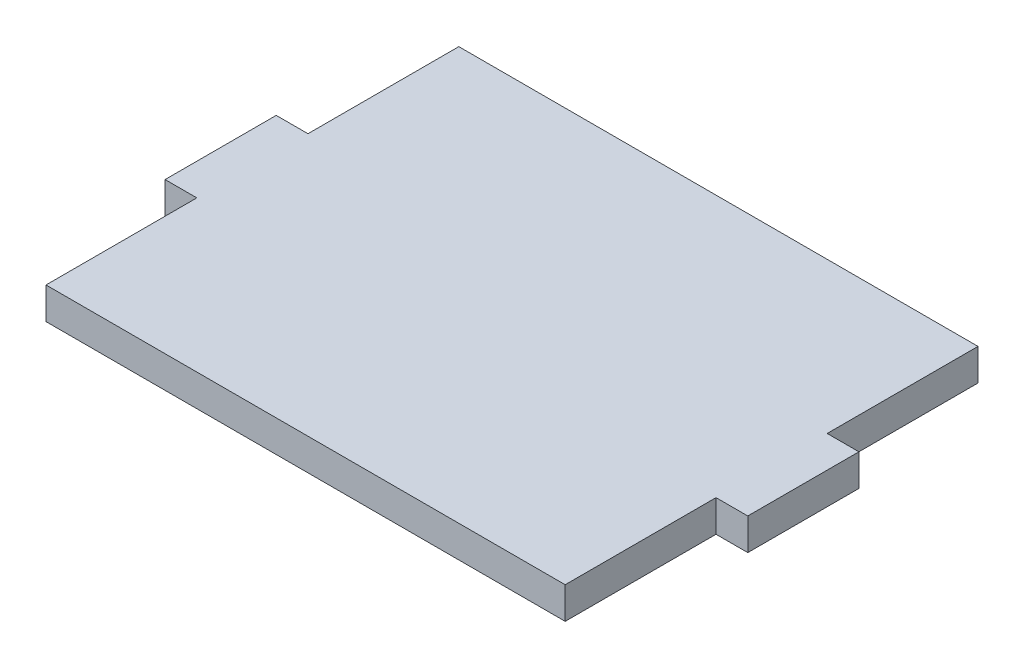
ISO-10303-21;
HEADER;
FILE_DESCRIPTION(('STEP AP214'),'2;1');
FILE_NAME('part.step','',(''),(''),'','','');
FILE_SCHEMA(('AUTOMOTIVE_DESIGN { 1 0 10303 214 1 1 1 1 }'));
ENDSEC;
DATA;
#1=APPLICATION_CONTEXT('core data for automotive mechanical design processes');
#2=APPLICATION_PROTOCOL_DEFINITION('international standard','automotive_design',2000,#1);
#3=PRODUCT_CONTEXT('',#1,'mechanical');
#4=PRODUCT('Part','Part','',(#3));
#5=PRODUCT_RELATED_PRODUCT_CATEGORY('part','',(#4));
#6=PRODUCT_DEFINITION_FORMATION('','',#4);
#7=PRODUCT_DEFINITION_CONTEXT('part definition',#1,'design');
#8=PRODUCT_DEFINITION('design','',#6,#7);
#9=PRODUCT_DEFINITION_SHAPE('','',#8);
#10=(LENGTH_UNIT() NAMED_UNIT(*) SI_UNIT(.MILLI.,.METRE.));
#11=(NAMED_UNIT(*) PLANE_ANGLE_UNIT() SI_UNIT($,.RADIAN.));
#12=(NAMED_UNIT(*) SI_UNIT($,.STERADIAN.) SOLID_ANGLE_UNIT());
#13=UNCERTAINTY_MEASURE_WITH_UNIT(LENGTH_MEASURE(1.E-05),#10,'distance_accuracy_value','');
#14=(GEOMETRIC_REPRESENTATION_CONTEXT(3) GLOBAL_UNCERTAINTY_ASSIGNED_CONTEXT((#13)) GLOBAL_UNIT_ASSIGNED_CONTEXT((#10,
#11,#12)) REPRESENTATION_CONTEXT('',''));
#15=CARTESIAN_POINT('',(0.,0.,0.));
#16=DIRECTION('',(0.,0.,1.));
#17=DIRECTION('',(1.,0.,0.));
#18=AXIS2_PLACEMENT_3D('',#15,#16,#17);
#19=CARTESIAN_POINT('',(16.35,2.,0.));
#20=DIRECTION('',(1.,0.,0.));
#21=DIRECTION('',(0.,0.,-1.));
#22=AXIS2_PLACEMENT_3D('',#19,#20,#21);
#23=PLANE('',#22);
#24=DIRECTION('',(0.,0.,1.));
#25=VECTOR('',#24,1.);
#26=CARTESIAN_POINT('',(16.35,0.,0.));
#27=LINE('',#26,#25);
#28=CARTESIAN_POINT('',(16.35,0.,-13.));
#29=VERTEX_POINT('',#28);
#30=CARTESIAN_POINT('',(16.35,0.,-3.5));
#31=VERTEX_POINT('',#30);
#32=EDGE_CURVE('E152',#29,#31,#27,.T.);
#33=ORIENTED_EDGE('',*,*,#32,.F.);
#34=DIRECTION('',(0.,-1.,0.));
#35=VECTOR('',#34,1.);
#36=CARTESIAN_POINT('',(16.35,2.,-13.));
#37=LINE('',#36,#35);
#38=CARTESIAN_POINT('',(16.35,2.,-13.));
#39=VERTEX_POINT('',#38);
#40=EDGE_CURVE('E11',#39,#29,#37,.T.);
#41=ORIENTED_EDGE('',*,*,#40,.F.);
#42=DIRECTION('',(0.,0.,1.));
#43=VECTOR('',#42,1.);
#44=CARTESIAN_POINT('',(16.35,2.,0.));
#45=LINE('',#44,#43);
#46=CARTESIAN_POINT('',(16.35,2.,-3.5));
#47=VERTEX_POINT('',#46);
#48=EDGE_CURVE('E178',#39,#47,#45,.T.);
#49=ORIENTED_EDGE('',*,*,#48,.T.);
#50=DIRECTION('',(0.,-1.,0.));
#51=VECTOR('',#50,1.);
#52=CARTESIAN_POINT('',(16.35,2.,-3.5));
#53=LINE('',#52,#51);
#54=EDGE_CURVE('E52',#47,#31,#53,.T.);
#55=ORIENTED_EDGE('',*,*,#54,.T.);
#56=EDGE_LOOP('',(#33,#41,#49,#55));
#57=FACE_BOUND('',#56,.T.);
#58=ADVANCED_FACE('F35',(#57),#23,.T.);
#59=CARTESIAN_POINT('',(0.,2.,-13.));
#60=DIRECTION('',(0.,0.,-1.));
#61=DIRECTION('',(-1.,0.,0.));
#62=AXIS2_PLACEMENT_3D('',#59,#60,#61);
#63=PLANE('',#62);
#64=DIRECTION('',(1.,0.,0.));
#65=VECTOR('',#64,1.);
#66=CARTESIAN_POINT('',(0.,0.,-13.));
#67=LINE('',#66,#65);
#68=CARTESIAN_POINT('',(-16.35,0.,-13.));
#69=VERTEX_POINT('',#68);
#70=EDGE_CURVE('E154',#69,#29,#67,.T.);
#71=ORIENTED_EDGE('',*,*,#70,.F.);
#72=DIRECTION('',(0.,-1.,0.));
#73=VECTOR('',#72,1.);
#74=CARTESIAN_POINT('',(-16.35,2.,-13.));
#75=LINE('',#74,#73);
#76=CARTESIAN_POINT('',(-16.35,2.,-13.));
#77=VERTEX_POINT('',#76);
#78=EDGE_CURVE('E44',#77,#69,#75,.T.);
#79=ORIENTED_EDGE('',*,*,#78,.F.);
#80=DIRECTION('',(1.,0.,0.));
#81=VECTOR('',#80,1.);
#82=CARTESIAN_POINT('',(0.,2.,-13.));
#83=LINE('',#82,#81);
#84=EDGE_CURVE('E210',#77,#39,#83,.T.);
#85=ORIENTED_EDGE('',*,*,#84,.T.);
#86=ORIENTED_EDGE('',*,*,#40,.T.);
#87=EDGE_LOOP('',(#71,#79,#85,#86));
#88=FACE_BOUND('',#87,.T.);
#89=ADVANCED_FACE('F37',(#88),#63,.T.);
#90=CARTESIAN_POINT('',(-16.35,2.,0.));
#91=DIRECTION('',(1.,0.,0.));
#92=DIRECTION('',(0.,0.,-1.));
#93=AXIS2_PLACEMENT_3D('',#90,#91,#92);
#94=PLANE('',#93);
#95=DIRECTION('',(0.,0.,1.));
#96=VECTOR('',#95,1.);
#97=CARTESIAN_POINT('',(-16.35,0.,0.));
#98=LINE('',#97,#96);
#99=CARTESIAN_POINT('',(-16.35,0.,-3.5));
#100=VERTEX_POINT('',#99);
#101=EDGE_CURVE('E158',#69,#100,#98,.T.);
#102=ORIENTED_EDGE('',*,*,#101,.T.);
#103=DIRECTION('',(0.,-1.,0.));
#104=VECTOR('',#103,1.);
#105=CARTESIAN_POINT('',(-16.35,2.,-3.5));
#106=LINE('',#105,#104);
#107=CARTESIAN_POINT('',(-16.35,2.,-3.5));
#108=VERTEX_POINT('',#107);
#109=EDGE_CURVE('E194',#108,#100,#106,.T.);
#110=ORIENTED_EDGE('',*,*,#109,.F.);
#111=DIRECTION('',(0.,0.,1.));
#112=VECTOR('',#111,1.);
#113=CARTESIAN_POINT('',(-16.35,2.,0.));
#114=LINE('',#113,#112);
#115=EDGE_CURVE('E201',#77,#108,#114,.T.);
#116=ORIENTED_EDGE('',*,*,#115,.F.);
#117=ORIENTED_EDGE('',*,*,#78,.T.);
#118=EDGE_LOOP('',(#102,#110,#116,#117));
#119=FACE_BOUND('',#118,.T.);
#120=ADVANCED_FACE('F199',(#119),#94,.F.);
#121=CARTESIAN_POINT('',(0.,2.,-3.5));
#122=DIRECTION('',(0.,0.,1.));
#123=DIRECTION('',(1.,0.,0.));
#124=AXIS2_PLACEMENT_3D('',#121,#122,#123);
#125=PLANE('',#124);
#126=DIRECTION('',(-1.,0.,0.));
#127=VECTOR('',#126,1.);
#128=CARTESIAN_POINT('',(0.,0.,-3.5));
#129=LINE('',#128,#127);
#130=CARTESIAN_POINT('',(-18.35,0.,-3.5));
#131=VERTEX_POINT('',#130);
#132=EDGE_CURVE('E160',#100,#131,#129,.T.);
#133=ORIENTED_EDGE('',*,*,#132,.T.);
#134=DIRECTION('',(0.,-1.,0.));
#135=VECTOR('',#134,1.);
#136=CARTESIAN_POINT('',(-18.35,2.,-3.5));
#137=LINE('',#136,#135);
#138=CARTESIAN_POINT('',(-18.35,2.,-3.5));
#139=VERTEX_POINT('',#138);
#140=EDGE_CURVE('E191',#139,#131,#137,.T.);
#141=ORIENTED_EDGE('',*,*,#140,.F.);
#142=DIRECTION('',(-1.,0.,0.));
#143=VECTOR('',#142,1.);
#144=CARTESIAN_POINT('',(0.,2.,-3.5));
#145=LINE('',#144,#143);
#146=EDGE_CURVE('E264',#108,#139,#145,.T.);
#147=ORIENTED_EDGE('',*,*,#146,.F.);
#148=ORIENTED_EDGE('',*,*,#109,.T.);
#149=EDGE_LOOP('',(#133,#141,#147,#148));
#150=FACE_BOUND('',#149,.T.);
#151=ADVANCED_FACE('F263',(#150),#125,.F.);
#152=CARTESIAN_POINT('',(-18.35,2.,0.));
#153=DIRECTION('',(1.,0.,0.));
#154=DIRECTION('',(0.,0.,-1.));
#155=AXIS2_PLACEMENT_3D('',#152,#153,#154);
#156=PLANE('',#155);
#157=DIRECTION('',(0.,0.,1.));
#158=VECTOR('',#157,1.);
#159=CARTESIAN_POINT('',(-18.35,0.,0.));
#160=LINE('',#159,#158);
#161=CARTESIAN_POINT('',(-18.35,0.,3.5));
#162=VERTEX_POINT('',#161);
#163=EDGE_CURVE('E163',#131,#162,#160,.T.);
#164=ORIENTED_EDGE('',*,*,#163,.T.);
#165=DIRECTION('',(0.,-1.,0.));
#166=VECTOR('',#165,1.);
#167=CARTESIAN_POINT('',(-18.35,2.,3.5));
#168=LINE('',#167,#166);
#169=CARTESIAN_POINT('',(-18.35,2.,3.5));
#170=VERTEX_POINT('',#169);
#171=EDGE_CURVE('E189',#170,#162,#168,.T.);
#172=ORIENTED_EDGE('',*,*,#171,.F.);
#173=DIRECTION('',(0.,0.,1.));
#174=VECTOR('',#173,1.);
#175=CARTESIAN_POINT('',(-18.35,2.,0.));
#176=LINE('',#175,#174);
#177=EDGE_CURVE('E260',#139,#170,#176,.T.);
#178=ORIENTED_EDGE('',*,*,#177,.F.);
#179=ORIENTED_EDGE('',*,*,#140,.T.);
#180=EDGE_LOOP('',(#164,#172,#178,#179));
#181=FACE_BOUND('',#180,.T.);
#182=ADVANCED_FACE('F257',(#181),#156,.F.);
#183=CARTESIAN_POINT('',(0.,2.,3.5));
#184=DIRECTION('',(0.,0.,1.));
#185=DIRECTION('',(1.,0.,0.));
#186=AXIS2_PLACEMENT_3D('',#183,#184,#185);
#187=PLANE('',#186);
#188=DIRECTION('',(-1.,0.,0.));
#189=VECTOR('',#188,1.);
#190=CARTESIAN_POINT('',(0.,0.,3.5));
#191=LINE('',#190,#189);
#192=CARTESIAN_POINT('',(-16.35,0.,3.5));
#193=VERTEX_POINT('',#192);
#194=EDGE_CURVE('E166',#193,#162,#191,.T.);
#195=ORIENTED_EDGE('',*,*,#194,.F.);
#196=DIRECTION('',(0.,-1.,0.));
#197=VECTOR('',#196,1.);
#198=CARTESIAN_POINT('',(-16.35,2.,3.5));
#199=LINE('',#198,#197);
#200=CARTESIAN_POINT('',(-16.35,2.,3.5));
#201=VERTEX_POINT('',#200);
#202=EDGE_CURVE('E187',#201,#193,#199,.T.);
#203=ORIENTED_EDGE('',*,*,#202,.F.);
#204=DIRECTION('',(-1.,0.,0.));
#205=VECTOR('',#204,1.);
#206=CARTESIAN_POINT('',(0.,2.,3.5));
#207=LINE('',#206,#205);
#208=EDGE_CURVE('E254',#201,#170,#207,.T.);
#209=ORIENTED_EDGE('',*,*,#208,.T.);
#210=ORIENTED_EDGE('',*,*,#171,.T.);
#211=EDGE_LOOP('',(#195,#203,#209,#210));
#212=FACE_BOUND('',#211,.T.);
#213=ADVANCED_FACE('F253',(#212),#187,.T.);
#214=CARTESIAN_POINT('',(-16.35,0.,13.));
#215=VERTEX_POINT('',#214);
#216=EDGE_CURVE('E161',#193,#215,#98,.T.);
#217=ORIENTED_EDGE('',*,*,#216,.T.);
#218=DIRECTION('',(0.,-1.,0.));
#219=VECTOR('',#218,1.);
#220=CARTESIAN_POINT('',(-16.35,2.,13.));
#221=LINE('',#220,#219);
#222=CARTESIAN_POINT('',(-16.35,2.,13.));
#223=VERTEX_POINT('',#222);
#224=EDGE_CURVE('E184',#223,#215,#221,.T.);
#225=ORIENTED_EDGE('',*,*,#224,.F.);
#226=EDGE_CURVE('E249',#201,#223,#114,.T.);
#227=ORIENTED_EDGE('',*,*,#226,.F.);
#228=ORIENTED_EDGE('',*,*,#202,.T.);
#229=EDGE_LOOP('',(#217,#225,#227,#228));
#230=FACE_BOUND('',#229,.T.);
#231=ADVANCED_FACE('F236',(#230),#94,.F.);
#232=CARTESIAN_POINT('',(0.,2.,13.));
#233=DIRECTION('',(0.,0.,-1.));
#234=DIRECTION('',(-1.,0.,0.));
#235=AXIS2_PLACEMENT_3D('',#232,#233,#234);
#236=PLANE('',#235);
#237=DIRECTION('',(1.,0.,0.));
#238=VECTOR('',#237,1.);
#239=CARTESIAN_POINT('',(0.,0.,13.));
#240=LINE('',#239,#238);
#241=CARTESIAN_POINT('',(16.35,0.,13.));
#242=VERTEX_POINT('',#241);
#243=EDGE_CURVE('E169',#215,#242,#240,.T.);
#244=ORIENTED_EDGE('',*,*,#243,.T.);
#245=DIRECTION('',(0.,-1.,0.));
#246=VECTOR('',#245,1.);
#247=CARTESIAN_POINT('',(16.35,2.,13.));
#248=LINE('',#247,#246);
#249=CARTESIAN_POINT('',(16.35,2.,13.));
#250=VERTEX_POINT('',#249);
#251=EDGE_CURVE('E182',#250,#242,#248,.T.);
#252=ORIENTED_EDGE('',*,*,#251,.F.);
#253=DIRECTION('',(1.,0.,0.));
#254=VECTOR('',#253,1.);
#255=CARTESIAN_POINT('',(0.,2.,13.));
#256=LINE('',#255,#254);
#257=EDGE_CURVE('E246',#223,#250,#256,.T.);
#258=ORIENTED_EDGE('',*,*,#257,.F.);
#259=ORIENTED_EDGE('',*,*,#224,.T.);
#260=EDGE_LOOP('',(#244,#252,#258,#259));
#261=FACE_BOUND('',#260,.T.);
#262=ADVANCED_FACE('F230',(#261),#236,.F.);
#263=CARTESIAN_POINT('',(16.35,0.,3.5));
#264=VERTEX_POINT('',#263);
#265=EDGE_CURVE('E155',#264,#242,#27,.T.);
#266=ORIENTED_EDGE('',*,*,#265,.F.);
#267=DIRECTION('',(0.,-1.,0.));
#268=VECTOR('',#267,1.);
#269=CARTESIAN_POINT('',(16.35,2.,3.5));
#270=LINE('',#269,#268);
#271=CARTESIAN_POINT('',(16.35,2.,3.5));
#272=VERTEX_POINT('',#271);
#273=EDGE_CURVE('E144',#272,#264,#270,.T.);
#274=ORIENTED_EDGE('',*,*,#273,.F.);
#275=EDGE_CURVE('E134',#272,#250,#45,.T.);
#276=ORIENTED_EDGE('',*,*,#275,.T.);
#277=ORIENTED_EDGE('',*,*,#251,.T.);
#278=EDGE_LOOP('',(#266,#274,#276,#277));
#279=FACE_BOUND('',#278,.T.);
#280=ADVANCED_FACE('F223',(#279),#23,.T.);
#281=CARTESIAN_POINT('',(0.,2.,3.5));
#282=DIRECTION('',(0.,0.,-1.));
#283=DIRECTION('',(-1.,0.,0.));
#284=AXIS2_PLACEMENT_3D('',#281,#282,#283);
#285=PLANE('',#284);
#286=DIRECTION('',(1.,0.,0.));
#287=VECTOR('',#286,1.);
#288=CARTESIAN_POINT('',(0.,0.,3.5));
#289=LINE('',#288,#287);
#290=CARTESIAN_POINT('',(18.35,0.,3.5));
#291=VERTEX_POINT('',#290);
#292=EDGE_CURVE('E141',#264,#291,#289,.T.);
#293=ORIENTED_EDGE('',*,*,#292,.T.);
#294=DIRECTION('',(0.,-1.,0.));
#295=VECTOR('',#294,1.);
#296=CARTESIAN_POINT('',(18.35,2.,3.5));
#297=LINE('',#296,#295);
#298=CARTESIAN_POINT('',(18.35,2.,3.5));
#299=VERTEX_POINT('',#298);
#300=EDGE_CURVE('E138',#299,#291,#297,.T.);
#301=ORIENTED_EDGE('',*,*,#300,.F.);
#302=DIRECTION('',(1.,0.,0.));
#303=VECTOR('',#302,1.);
#304=CARTESIAN_POINT('',(0.,2.,3.5));
#305=LINE('',#304,#303);
#306=EDGE_CURVE('E127',#272,#299,#305,.T.);
#307=ORIENTED_EDGE('',*,*,#306,.F.);
#308=ORIENTED_EDGE('',*,*,#273,.T.);
#309=EDGE_LOOP('',(#293,#301,#307,#308));
#310=FACE_BOUND('',#309,.T.);
#311=ADVANCED_FACE('F139',(#310),#285,.F.);
#312=CARTESIAN_POINT('',(18.35,2.,0.));
#313=DIRECTION('',(-1.,0.,0.));
#314=DIRECTION('',(0.,0.,1.));
#315=AXIS2_PLACEMENT_3D('',#312,#313,#314);
#316=PLANE('',#315);
#317=DIRECTION('',(0.,0.,-1.));
#318=VECTOR('',#317,1.);
#319=CARTESIAN_POINT('',(18.35,0.,0.));
#320=LINE('',#319,#318);
#321=CARTESIAN_POINT('',(18.35,0.,-3.5));
#322=VERTEX_POINT('',#321);
#323=EDGE_CURVE('E173',#291,#322,#320,.T.);
#324=ORIENTED_EDGE('',*,*,#323,.T.);
#325=DIRECTION('',(0.,-1.,0.));
#326=VECTOR('',#325,1.);
#327=CARTESIAN_POINT('',(18.35,2.,-3.5));
#328=LINE('',#327,#326);
#329=CARTESIAN_POINT('',(18.35,2.,-3.5));
#330=VERTEX_POINT('',#329);
#331=EDGE_CURVE('E90',#330,#322,#328,.T.);
#332=ORIENTED_EDGE('',*,*,#331,.F.);
#333=DIRECTION('',(0.,0.,-1.));
#334=VECTOR('',#333,1.);
#335=CARTESIAN_POINT('',(18.35,2.,0.));
#336=LINE('',#335,#334);
#337=EDGE_CURVE('E132',#299,#330,#336,.T.);
#338=ORIENTED_EDGE('',*,*,#337,.F.);
#339=ORIENTED_EDGE('',*,*,#300,.T.);
#340=EDGE_LOOP('',(#324,#332,#338,#339));
#341=FACE_BOUND('',#340,.T.);
#342=ADVANCED_FACE('F146',(#341),#316,.F.);
#343=CARTESIAN_POINT('',(0.,2.,-3.5));
#344=DIRECTION('',(0.,0.,-1.));
#345=DIRECTION('',(-1.,0.,0.));
#346=AXIS2_PLACEMENT_3D('',#343,#344,#345);
#347=PLANE('',#346);
#348=DIRECTION('',(1.,0.,0.));
#349=VECTOR('',#348,1.);
#350=CARTESIAN_POINT('',(0.,0.,-3.5));
#351=LINE('',#350,#349);
#352=EDGE_CURVE('E175',#31,#322,#351,.T.);
#353=ORIENTED_EDGE('',*,*,#352,.F.);
#354=ORIENTED_EDGE('',*,*,#54,.F.);
#355=DIRECTION('',(1.,0.,0.));
#356=VECTOR('',#355,1.);
#357=CARTESIAN_POINT('',(0.,2.,-3.5));
#358=LINE('',#357,#356);
#359=EDGE_CURVE('E147',#47,#330,#358,.T.);
#360=ORIENTED_EDGE('',*,*,#359,.T.);
#361=ORIENTED_EDGE('',*,*,#331,.T.);
#362=EDGE_LOOP('',(#353,#354,#360,#361));
#363=FACE_BOUND('',#362,.T.);
#364=ADVANCED_FACE('F211',(#363),#347,.T.);
#365=CARTESIAN_POINT('',(0.,2.,0.));
#366=DIRECTION('',(0.,1.,0.));
#367=DIRECTION('',(0.,0.,1.));
#368=AXIS2_PLACEMENT_3D('',#365,#366,#367);
#369=PLANE('',#368);
#370=ORIENTED_EDGE('',*,*,#48,.F.);
#371=ORIENTED_EDGE('',*,*,#84,.F.);
#372=ORIENTED_EDGE('',*,*,#115,.T.);
#373=ORIENTED_EDGE('',*,*,#146,.T.);
#374=ORIENTED_EDGE('',*,*,#177,.T.);
#375=ORIENTED_EDGE('',*,*,#208,.F.);
#376=ORIENTED_EDGE('',*,*,#226,.T.);
#377=ORIENTED_EDGE('',*,*,#257,.T.);
#378=ORIENTED_EDGE('',*,*,#275,.F.);
#379=ORIENTED_EDGE('',*,*,#306,.T.);
#380=ORIENTED_EDGE('',*,*,#337,.T.);
#381=ORIENTED_EDGE('',*,*,#359,.F.);
#382=EDGE_LOOP('',(#370,#371,#372,#373,#374,#375,#376,#377,#378,#379,#380,#381));
#383=FACE_BOUND('',#382,.T.);
#384=ADVANCED_FACE('F129',(#383),#369,.T.);
#385=CARTESIAN_POINT('',(0.,0.,0.));
#386=DIRECTION('',(0.,1.,0.));
#387=DIRECTION('',(0.,0.,1.));
#388=AXIS2_PLACEMENT_3D('',#385,#386,#387);
#389=PLANE('',#388);
#390=ORIENTED_EDGE('',*,*,#32,.T.);
#391=ORIENTED_EDGE('',*,*,#352,.T.);
#392=ORIENTED_EDGE('',*,*,#323,.F.);
#393=ORIENTED_EDGE('',*,*,#292,.F.);
#394=ORIENTED_EDGE('',*,*,#265,.T.);
#395=ORIENTED_EDGE('',*,*,#243,.F.);
#396=ORIENTED_EDGE('',*,*,#216,.F.);
#397=ORIENTED_EDGE('',*,*,#194,.T.);
#398=ORIENTED_EDGE('',*,*,#163,.F.);
#399=ORIENTED_EDGE('',*,*,#132,.F.);
#400=ORIENTED_EDGE('',*,*,#101,.F.);
#401=ORIENTED_EDGE('',*,*,#70,.T.);
#402=EDGE_LOOP('',(#390,#391,#392,#393,#394,#395,#396,#397,#398,#399,#400,#401));
#403=FACE_BOUND('',#402,.T.);
#404=ADVANCED_FACE('F208',(#403),#389,.F.);
#405=CLOSED_SHELL('',(#58,#89,#120,#151,#182,#213,#231,#262,#280,#311,#342,#364,#384,#404));
#406=MANIFOLD_SOLID_BREP('B2',#405);
#407=ADVANCED_BREP_SHAPE_REPRESENTATION('',(#18,#406),#14);
#408=SHAPE_DEFINITION_REPRESENTATION(#9,#407);
ENDSEC;
END-ISO-10303-21;
